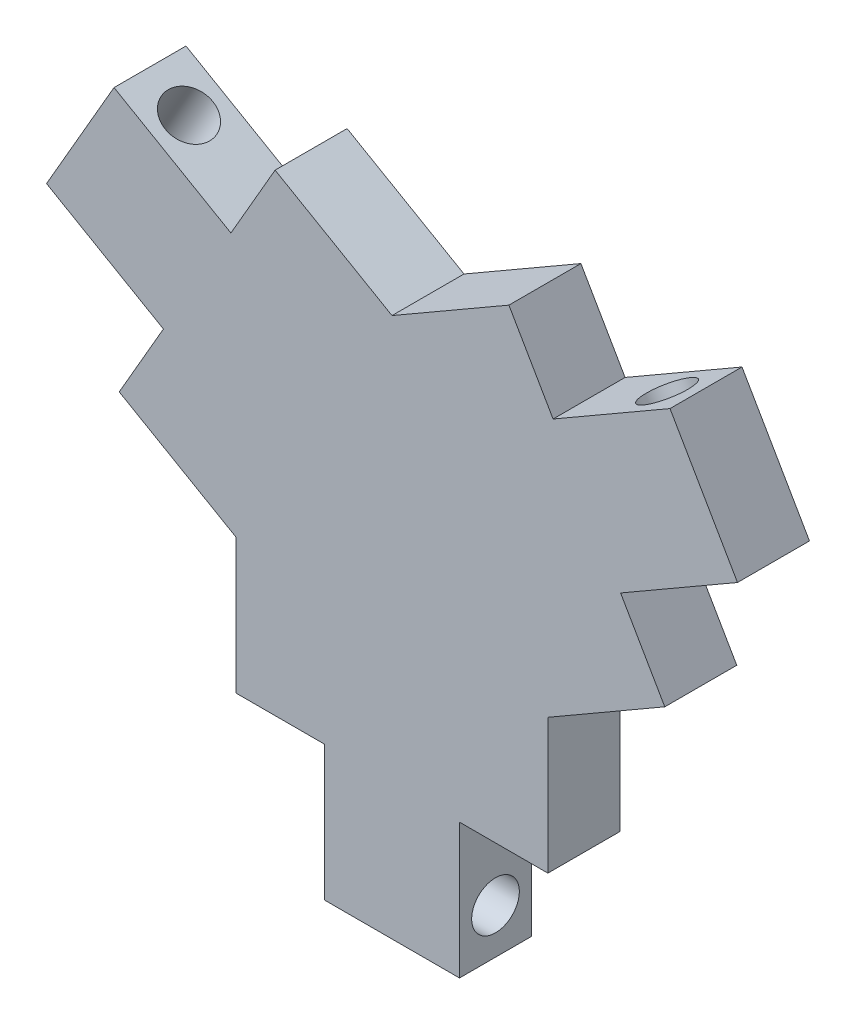
ISO-10303-21;
HEADER;
FILE_DESCRIPTION(('STEP AP214'),'2;1');
FILE_NAME('part.step','',(''),(''),'','','');
FILE_SCHEMA(('AUTOMOTIVE_DESIGN { 1 0 10303 214 1 1 1 1 }'));
ENDSEC;
DATA;
#1=APPLICATION_CONTEXT('core data for automotive mechanical design processes');
#2=APPLICATION_PROTOCOL_DEFINITION('international standard','automotive_design',2000,#1);
#3=PRODUCT_CONTEXT('',#1,'mechanical');
#4=PRODUCT('Part','Part','',(#3));
#5=PRODUCT_RELATED_PRODUCT_CATEGORY('part','',(#4));
#6=PRODUCT_DEFINITION_FORMATION('','',#4);
#7=PRODUCT_DEFINITION_CONTEXT('part definition',#1,'design');
#8=PRODUCT_DEFINITION('design','',#6,#7);
#9=PRODUCT_DEFINITION_SHAPE('','',#8);
#10=(LENGTH_UNIT() NAMED_UNIT(*) SI_UNIT(.MILLI.,.METRE.));
#11=(NAMED_UNIT(*) PLANE_ANGLE_UNIT() SI_UNIT($,.RADIAN.));
#12=(NAMED_UNIT(*) SI_UNIT($,.STERADIAN.) SOLID_ANGLE_UNIT());
#13=UNCERTAINTY_MEASURE_WITH_UNIT(LENGTH_MEASURE(1.E-05),#10,'distance_accuracy_value','');
#14=(GEOMETRIC_REPRESENTATION_CONTEXT(3) GLOBAL_UNCERTAINTY_ASSIGNED_CONTEXT((#13)) GLOBAL_UNIT_ASSIGNED_CONTEXT((#10,
#11,#12)) REPRESENTATION_CONTEXT('',''));
#15=CARTESIAN_POINT('',(0.,0.,0.));
#16=DIRECTION('',(0.,0.,1.));
#17=DIRECTION('',(1.,0.,0.));
#18=AXIS2_PLACEMENT_3D('',#15,#16,#17);
#19=CARTESIAN_POINT('',(25.9817621135331,-4.99999999999999,4.));
#20=DIRECTION('',(-1.,0.,0.));
#21=DIRECTION('',(0.,0.,1.));
#22=AXIS2_PLACEMENT_3D('',#19,#20,#21);
#23=CYLINDRICAL_SURFACE('',#22,2.65);
#24=CARTESIAN_POINT('',(-9.82050807568876,-4.99999999999999,4.));
#25=DIRECTION('',(-1.,0.,0.));
#26=DIRECTION('',(0.,0.,1.));
#27=AXIS2_PLACEMENT_3D('',#24,#25,#26);
#28=CIRCLE('',#27,2.65);
#29=CARTESIAN_POINT('',(-9.82050807568876,-4.99999999999999,6.65));
#30=VERTEX_POINT('',#29);
#31=EDGE_CURVE('E423',#30,#30,#28,.T.);
#32=ORIENTED_EDGE('',*,*,#31,.F.);
#33=EDGE_LOOP('',(#32));
#34=FACE_BOUND('',#33,.T.);
#35=CARTESIAN_POINT('',(-24.8205080756888,-4.99999999999999,4.));
#36=DIRECTION('',(1.,0.,0.));
#37=DIRECTION('',(0.,0.,-1.));
#38=AXIS2_PLACEMENT_3D('',#35,#36,#37);
#39=CIRCLE('',#38,2.65);
#40=CARTESIAN_POINT('',(-24.8205080756888,-4.99999999999999,1.35));
#41=VERTEX_POINT('',#40);
#42=EDGE_CURVE('E277',#41,#41,#39,.T.);
#43=ORIENTED_EDGE('',*,*,#42,.F.);
#44=EDGE_LOOP('',(#43));
#45=FACE_BOUND('',#44,.T.);
#46=ADVANCED_FACE('F50',(#34,#45),#23,.F.);
#47=CARTESIAN_POINT('',(-34.6410161513775,5.,-0.000999999999999265));
#48=DIRECTION('',(0.,1.,0.));
#49=DIRECTION('',(0.,0.,1.));
#50=AXIS2_PLACEMENT_3D('',#47,#48,#49);
#51=PLANE('',#50);
#52=DIRECTION('',(1.,0.,0.));
#53=VECTOR('',#52,1.);
#54=CARTESIAN_POINT('',(-34.6410161513775,5.,0.));
#55=LINE('',#54,#53);
#56=CARTESIAN_POINT('',(-34.6410161513775,5.,0.));
#57=VERTEX_POINT('',#56);
#58=CARTESIAN_POINT('',(-24.8205080756888,5.,0.));
#59=VERTEX_POINT('',#58);
#60=EDGE_CURVE('E322',#57,#59,#55,.T.);
#61=ORIENTED_EDGE('',*,*,#60,.T.);
#62=DIRECTION('',(0.,0.,1.));
#63=VECTOR('',#62,1.);
#64=CARTESIAN_POINT('',(-24.8205080756888,5.,-0.000999999999999265));
#65=LINE('',#64,#63);
#66=CARTESIAN_POINT('',(-24.8205080756888,5.,8.));
#67=VERTEX_POINT('',#66);
#68=EDGE_CURVE('E309',#59,#67,#65,.T.);
#69=ORIENTED_EDGE('',*,*,#68,.T.);
#70=DIRECTION('',(-1.,0.,0.));
#71=VECTOR('',#70,1.);
#72=CARTESIAN_POINT('',(-34.6410161513775,5.,8.));
#73=LINE('',#72,#71);
#74=CARTESIAN_POINT('',(-34.6410161513775,5.,8.));
#75=VERTEX_POINT('',#74);
#76=EDGE_CURVE('E313',#67,#75,#73,.T.);
#77=ORIENTED_EDGE('',*,*,#76,.T.);
#78=DIRECTION('',(0.,0.,1.));
#79=VECTOR('',#78,1.);
#80=CARTESIAN_POINT('',(-34.6410161513775,5.,-0.000999999999999265));
#81=LINE('',#80,#79);
#82=EDGE_CURVE('E314',#57,#75,#81,.T.);
#83=ORIENTED_EDGE('',*,*,#82,.F.);
#84=EDGE_LOOP('',(#61,#69,#77,#83));
#85=FACE_BOUND('',#84,.T.);
#86=ADVANCED_FACE('F482',(#85),#51,.F.);
#87=CARTESIAN_POINT('',(-24.8205080756888,5.,-0.000999999999999265));
#88=DIRECTION('',(1.,0.,0.));
#89=DIRECTION('',(0.,0.,-1.));
#90=AXIS2_PLACEMENT_3D('',#87,#88,#89);
#91=PLANE('',#90);
#92=DIRECTION('',(0.,-1.,0.));
#93=VECTOR('',#92,1.);
#94=CARTESIAN_POINT('',(-24.8205080756888,5.,0.));
#95=LINE('',#94,#93);
#96=CARTESIAN_POINT('',(-24.8205080756888,-9.99999999999999,0.));
#97=VERTEX_POINT('',#96);
#98=EDGE_CURVE('E300',#59,#97,#95,.T.);
#99=ORIENTED_EDGE('',*,*,#98,.T.);
#100=DIRECTION('',(0.,0.,1.));
#101=VECTOR('',#100,1.);
#102=CARTESIAN_POINT('',(-24.8205080756888,-9.99999999999999,-0.000999999999999265));
#103=LINE('',#102,#101);
#104=CARTESIAN_POINT('',(-24.8205080756888,-9.99999999999999,8.));
#105=VERTEX_POINT('',#104);
#106=EDGE_CURVE('E304',#97,#105,#103,.T.);
#107=ORIENTED_EDGE('',*,*,#106,.T.);
#108=DIRECTION('',(0.,1.,0.));
#109=VECTOR('',#108,1.);
#110=CARTESIAN_POINT('',(-24.8205080756888,5.,8.));
#111=LINE('',#110,#109);
#112=EDGE_CURVE('E316',#105,#67,#111,.T.);
#113=ORIENTED_EDGE('',*,*,#112,.T.);
#114=ORIENTED_EDGE('',*,*,#68,.F.);
#115=EDGE_LOOP('',(#99,#107,#113,#114));
#116=FACE_BOUND('',#115,.T.);
#117=ORIENTED_EDGE('',*,*,#42,.T.);
#118=EDGE_LOOP('',(#117));
#119=FACE_BOUND('',#118,.T.);
#120=ADVANCED_FACE('F481',(#116,#119),#91,.F.);
#121=CARTESIAN_POINT('',(-9.82050807568876,5.,-0.000999999999999265));
#122=DIRECTION('',(0.,1.,0.));
#123=DIRECTION('',(0.,0.,1.));
#124=AXIS2_PLACEMENT_3D('',#121,#122,#123);
#125=PLANE('',#124);
#126=DIRECTION('',(1.,0.,0.));
#127=VECTOR('',#126,1.);
#128=CARTESIAN_POINT('',(-9.82050807568876,5.,0.));
#129=LINE('',#128,#127);
#130=CARTESIAN_POINT('',(-9.82050807568876,5.,0.));
#131=VERTEX_POINT('',#130);
#132=CARTESIAN_POINT('',(0.,5.,0.));
#133=VERTEX_POINT('',#132);
#134=EDGE_CURVE('E328',#131,#133,#129,.T.);
#135=ORIENTED_EDGE('',*,*,#134,.T.);
#136=DIRECTION('',(0.,0.,1.));
#137=VECTOR('',#136,1.);
#138=CARTESIAN_POINT('',(0.,5.,-0.000999999999999265));
#139=LINE('',#138,#137);
#140=CARTESIAN_POINT('',(0.,5.,8.));
#141=VERTEX_POINT('',#140);
#142=EDGE_CURVE('E416',#133,#141,#139,.T.);
#143=ORIENTED_EDGE('',*,*,#142,.T.);
#144=DIRECTION('',(-1.,0.,0.));
#145=VECTOR('',#144,1.);
#146=CARTESIAN_POINT('',(-9.82050807568876,5.,8.));
#147=LINE('',#146,#145);
#148=CARTESIAN_POINT('',(-9.82050807568876,5.,8.));
#149=VERTEX_POINT('',#148);
#150=EDGE_CURVE('E406',#141,#149,#147,.T.);
#151=ORIENTED_EDGE('',*,*,#150,.T.);
#152=DIRECTION('',(0.,0.,1.));
#153=VECTOR('',#152,1.);
#154=CARTESIAN_POINT('',(-9.82050807568876,5.,-0.000999999999999265));
#155=LINE('',#154,#153);
#156=EDGE_CURVE('E417',#131,#149,#155,.T.);
#157=ORIENTED_EDGE('',*,*,#156,.F.);
#158=EDGE_LOOP('',(#135,#143,#151,#157));
#159=FACE_BOUND('',#158,.T.);
#160=ADVANCED_FACE('F475',(#159),#125,.F.);
#161=CARTESIAN_POINT('',(-9.82050807568876,5.,-0.000999999999999265));
#162=DIRECTION('',(-1.,0.,0.));
#163=DIRECTION('',(0.,0.,1.));
#164=AXIS2_PLACEMENT_3D('',#161,#162,#163);
#165=PLANE('',#164);
#166=DIRECTION('',(0.,1.,0.));
#167=VECTOR('',#166,1.);
#168=CARTESIAN_POINT('',(-9.82050807568876,5.,0.));
#169=LINE('',#168,#167);
#170=CARTESIAN_POINT('',(-9.82050807568876,-9.99999999999999,0.));
#171=VERTEX_POINT('',#170);
#172=EDGE_CURVE('E63',#171,#131,#169,.T.);
#173=ORIENTED_EDGE('',*,*,#172,.T.);
#174=ORIENTED_EDGE('',*,*,#156,.T.);
#175=DIRECTION('',(0.,-1.,0.));
#176=VECTOR('',#175,1.);
#177=CARTESIAN_POINT('',(-9.82050807568876,5.,8.));
#178=LINE('',#177,#176);
#179=CARTESIAN_POINT('',(-9.82050807568876,-9.99999999999999,8.));
#180=VERTEX_POINT('',#179);
#181=EDGE_CURVE('E412',#149,#180,#178,.T.);
#182=ORIENTED_EDGE('',*,*,#181,.T.);
#183=DIRECTION('',(0.,0.,1.));
#184=VECTOR('',#183,1.);
#185=CARTESIAN_POINT('',(-9.82050807568876,-9.99999999999999,-0.000999999999999265));
#186=LINE('',#185,#184);
#187=EDGE_CURVE('E303',#171,#180,#186,.T.);
#188=ORIENTED_EDGE('',*,*,#187,.F.);
#189=EDGE_LOOP('',(#173,#174,#182,#188));
#190=FACE_BOUND('',#189,.T.);
#191=ORIENTED_EDGE('',*,*,#31,.T.);
#192=EDGE_LOOP('',(#191));
#193=FACE_BOUND('',#192,.T.);
#194=ADVANCED_FACE('F478',(#190,#193),#165,.F.);
#195=CARTESIAN_POINT('',(17.3205080756888,30.,8.));
#196=DIRECTION('',(0.5,0.866025403784439,0.));
#197=DIRECTION('',(-0.866025403784439,0.5,0.));
#198=AXIS2_PLACEMENT_3D('',#195,#196,#197);
#199=PLANE('',#198);
#200=DIRECTION('',(0.866025403784439,-0.5,0.));
#201=VECTOR('',#200,1.);
#202=CARTESIAN_POINT('',(17.3205080756888,30.,0.));
#203=LINE('',#202,#201);
#204=CARTESIAN_POINT('',(-30.3108891324553,57.5,0.));
#205=VERTEX_POINT('',#204);
#206=CARTESIAN_POINT('',(-17.3205080756888,50.,0.));
#207=VERTEX_POINT('',#206);
#208=EDGE_CURVE('E276',#205,#207,#203,.T.);
#209=ORIENTED_EDGE('',*,*,#208,.F.);
#210=DIRECTION('',(0.,0.,1.));
#211=VECTOR('',#210,1.);
#212=CARTESIAN_POINT('',(-30.3108891324553,57.5,-0.000999999999999265));
#213=LINE('',#212,#211);
#214=CARTESIAN_POINT('',(-30.3108891324553,57.5,8.));
#215=VERTEX_POINT('',#214);
#216=EDGE_CURVE('E369',#205,#215,#213,.T.);
#217=ORIENTED_EDGE('',*,*,#216,.T.);
#218=DIRECTION('',(0.866025403784439,-0.5,0.));
#219=VECTOR('',#218,1.);
#220=CARTESIAN_POINT('',(17.3205080756888,30.,8.));
#221=LINE('',#220,#219);
#222=CARTESIAN_POINT('',(-17.3205080756888,50.,8.));
#223=VERTEX_POINT('',#222);
#224=EDGE_CURVE('E232',#215,#223,#221,.T.);
#225=ORIENTED_EDGE('',*,*,#224,.T.);
#226=DIRECTION('',(0.,0.,-1.));
#227=VECTOR('',#226,1.);
#228=CARTESIAN_POINT('',(-17.3205080756888,50.,8.));
#229=LINE('',#228,#227);
#230=EDGE_CURVE('E234',#223,#207,#229,.T.);
#231=ORIENTED_EDGE('',*,*,#230,.T.);
#232=EDGE_LOOP('',(#209,#217,#225,#231));
#233=FACE_BOUND('',#232,.T.);
#234=ADVANCED_FACE('F47',(#233),#199,.T.);
#235=CARTESIAN_POINT('',(-60.6217782649107,35.,8.));
#236=DIRECTION('',(-0.866025403784439,0.5,0.));
#237=DIRECTION('',(-0.5,-0.866025403784439,0.));
#238=AXIS2_PLACEMENT_3D('',#235,#236,#237);
#239=PLANE('',#238);
#240=DIRECTION('',(0.5,0.866025403784439,0.));
#241=VECTOR('',#240,1.);
#242=CARTESIAN_POINT('',(-60.6217782649107,35.,0.));
#243=LINE('',#242,#241);
#244=CARTESIAN_POINT('',(-55.7115242270663,43.5048094716167,0.));
#245=VERTEX_POINT('',#244);
#246=CARTESIAN_POINT('',(-48.2115242270663,56.4951905283833,0.));
#247=VERTEX_POINT('',#246);
#248=EDGE_CURVE('E285',#245,#247,#243,.T.);
#249=ORIENTED_EDGE('',*,*,#248,.F.);
#250=DIRECTION('',(0.,0.,1.));
#251=VECTOR('',#250,1.);
#252=CARTESIAN_POINT('',(-55.7115242270663,43.5048094716167,-0.000999999999999265));
#253=LINE('',#252,#251);
#254=CARTESIAN_POINT('',(-55.7115242270663,43.5048094716167,8.));
#255=VERTEX_POINT('',#254);
#256=EDGE_CURVE('E393',#245,#255,#253,.T.);
#257=ORIENTED_EDGE('',*,*,#256,.T.);
#258=DIRECTION('',(0.5,0.866025403784439,0.));
#259=VECTOR('',#258,1.);
#260=CARTESIAN_POINT('',(-60.6217782649107,35.,8.));
#261=LINE('',#260,#259);
#262=CARTESIAN_POINT('',(-48.2115242270663,56.4951905283833,8.));
#263=VERTEX_POINT('',#262);
#264=EDGE_CURVE('E264',#255,#263,#261,.T.);
#265=ORIENTED_EDGE('',*,*,#264,.T.);
#266=DIRECTION('',(0.,0.,1.));
#267=VECTOR('',#266,1.);
#268=CARTESIAN_POINT('',(-48.2115242270663,56.4951905283833,-0.000999999999999265));
#269=LINE('',#268,#267);
#270=EDGE_CURVE('E366',#247,#263,#269,.T.);
#271=ORIENTED_EDGE('',*,*,#270,.F.);
#272=EDGE_LOOP('',(#249,#257,#265,#271));
#273=FACE_BOUND('',#272,.T.);
#274=ADVANCED_FACE('F504',(#273),#239,.T.);
#275=CARTESIAN_POINT('',(-34.6410161513775,0.,8.));
#276=DIRECTION('',(-1.,0.,0.));
#277=DIRECTION('',(0.,0.,1.));
#278=AXIS2_PLACEMENT_3D('',#275,#276,#277);
#279=PLANE('',#278);
#280=DIRECTION('',(0.,1.,0.));
#281=VECTOR('',#280,1.);
#282=CARTESIAN_POINT('',(-34.6410161513775,0.,0.));
#283=LINE('',#282,#281);
#284=CARTESIAN_POINT('',(-34.6410161513776,20.,0.));
#285=VERTEX_POINT('',#284);
#286=EDGE_CURVE('E289',#57,#285,#283,.T.);
#287=ORIENTED_EDGE('',*,*,#286,.F.);
#288=ORIENTED_EDGE('',*,*,#82,.T.);
#289=DIRECTION('',(0.,1.,0.));
#290=VECTOR('',#289,1.);
#291=CARTESIAN_POINT('',(-34.6410161513775,0.,8.));
#292=LINE('',#291,#290);
#293=CARTESIAN_POINT('',(-34.6410161513776,20.,8.));
#294=VERTEX_POINT('',#293);
#295=EDGE_CURVE('E256',#75,#294,#292,.T.);
#296=ORIENTED_EDGE('',*,*,#295,.T.);
#297=DIRECTION('',(0.,0.,-1.));
#298=VECTOR('',#297,1.);
#299=CARTESIAN_POINT('',(-34.6410161513776,20.,8.));
#300=LINE('',#299,#298);
#301=EDGE_CURVE('E11',#294,#285,#300,.T.);
#302=ORIENTED_EDGE('',*,*,#301,.T.);
#303=EDGE_LOOP('',(#287,#288,#296,#302));
#304=FACE_BOUND('',#303,.T.);
#305=ADVANCED_FACE('F490',(#304),#279,.T.);
#306=CARTESIAN_POINT('',(0.,-9.99999999999999,8.));
#307=DIRECTION('',(0.,-1.,0.));
#308=DIRECTION('',(0.,0.,-1.));
#309=AXIS2_PLACEMENT_3D('',#306,#307,#308);
#310=PLANE('',#309);
#311=DIRECTION('',(-1.,0.,0.));
#312=VECTOR('',#311,1.);
#313=CARTESIAN_POINT('',(0.,-9.99999999999999,0.));
#314=LINE('',#313,#312);
#315=EDGE_CURVE('E230',#171,#97,#314,.T.);
#316=ORIENTED_EDGE('',*,*,#315,.F.);
#317=ORIENTED_EDGE('',*,*,#187,.T.);
#318=DIRECTION('',(-1.,0.,0.));
#319=VECTOR('',#318,1.);
#320=CARTESIAN_POINT('',(0.,-9.99999999999999,8.));
#321=LINE('',#320,#319);
#322=EDGE_CURVE('E255',#180,#105,#321,.T.);
#323=ORIENTED_EDGE('',*,*,#322,.T.);
#324=ORIENTED_EDGE('',*,*,#106,.F.);
#325=EDGE_LOOP('',(#316,#317,#323,#324));
#326=FACE_BOUND('',#325,.T.);
#327=ADVANCED_FACE('F305',(#326),#310,.T.);
#328=CARTESIAN_POINT('',(-8.66025403784439,15.,8.));
#329=DIRECTION('',(0.5,-0.866025403784439,0.));
#330=DIRECTION('',(0.866025403784439,0.5,0.));
#331=AXIS2_PLACEMENT_3D('',#328,#329,#330);
#332=PLANE('',#331);
#333=DIRECTION('',(-0.866025403784439,-0.5,0.));
#334=VECTOR('',#333,1.);
#335=CARTESIAN_POINT('',(-8.66025403784439,15.,0.));
#336=LINE('',#335,#334);
#337=CARTESIAN_POINT('',(12.9903810567666,27.5,0.));
#338=VERTEX_POINT('',#337);
#339=CARTESIAN_POINT('',(0.,20.,0.));
#340=VERTEX_POINT('',#339);
#341=EDGE_CURVE('E208',#338,#340,#336,.T.);
#342=ORIENTED_EDGE('',*,*,#341,.F.);
#343=DIRECTION('',(0.,0.,1.));
#344=VECTOR('',#343,1.);
#345=CARTESIAN_POINT('',(12.9903810567666,27.5,-0.000999999999999265));
#346=LINE('',#345,#344);
#347=CARTESIAN_POINT('',(12.9903810567666,27.5,8.));
#348=VERTEX_POINT('',#347);
#349=EDGE_CURVE('E186',#338,#348,#346,.T.);
#350=ORIENTED_EDGE('',*,*,#349,.T.);
#351=DIRECTION('',(-0.866025403784439,-0.5,0.));
#352=VECTOR('',#351,1.);
#353=CARTESIAN_POINT('',(-8.66025403784439,15.,8.));
#354=LINE('',#353,#352);
#355=CARTESIAN_POINT('',(0.,20.,8.));
#356=VERTEX_POINT('',#355);
#357=EDGE_CURVE('E250',#348,#356,#354,.T.);
#358=ORIENTED_EDGE('',*,*,#357,.T.);
#359=DIRECTION('',(0.,0.,-1.));
#360=VECTOR('',#359,1.);
#361=CARTESIAN_POINT('',(0.,20.,8.));
#362=LINE('',#361,#360);
#363=EDGE_CURVE('E57',#356,#340,#362,.T.);
#364=ORIENTED_EDGE('',*,*,#363,.T.);
#365=EDGE_LOOP('',(#342,#350,#358,#364));
#366=FACE_BOUND('',#365,.T.);
#367=ADVANCED_FACE('F216',(#366),#332,.T.);
#368=CARTESIAN_POINT('',(34.6410161513775,20.,8.));
#369=DIRECTION('',(0.866025403784439,0.5,0.));
#370=DIRECTION('',(-0.5,0.866025403784439,0.));
#371=AXIS2_PLACEMENT_3D('',#368,#369,#370);
#372=PLANE('',#371);
#373=DIRECTION('',(0.5,-0.866025403784439,0.));
#374=VECTOR('',#373,1.);
#375=CARTESIAN_POINT('',(34.6410161513775,20.,0.));
#376=LINE('',#375,#374);
#377=CARTESIAN_POINT('',(13.5705080756888,56.4951905283833,0.));
#378=VERTEX_POINT('',#377);
#379=CARTESIAN_POINT('',(21.0705080756888,43.5048094716167,0.));
#380=VERTEX_POINT('',#379);
#381=EDGE_CURVE('E219',#378,#380,#376,.T.);
#382=ORIENTED_EDGE('',*,*,#381,.F.);
#383=DIRECTION('',(0.,0.,1.));
#384=VECTOR('',#383,1.);
#385=CARTESIAN_POINT('',(13.5705080756888,56.4951905283833,-0.000999999999999265));
#386=LINE('',#385,#384);
#387=CARTESIAN_POINT('',(13.5705080756888,56.4951905283833,8.));
#388=VERTEX_POINT('',#387);
#389=EDGE_CURVE('E345',#378,#388,#386,.T.);
#390=ORIENTED_EDGE('',*,*,#389,.T.);
#391=DIRECTION('',(0.5,-0.866025403784439,0.));
#392=VECTOR('',#391,1.);
#393=CARTESIAN_POINT('',(34.6410161513775,20.,8.));
#394=LINE('',#393,#392);
#395=CARTESIAN_POINT('',(21.0705080756888,43.5048094716168,8.));
#396=VERTEX_POINT('',#395);
#397=EDGE_CURVE('E243',#388,#396,#394,.T.);
#398=ORIENTED_EDGE('',*,*,#397,.T.);
#399=DIRECTION('',(0.,0.,1.));
#400=VECTOR('',#399,1.);
#401=CARTESIAN_POINT('',(21.0705080756888,43.5048094716168,-0.000999999999999265));
#402=LINE('',#401,#400);
#403=EDGE_CURVE('E434',#380,#396,#402,.T.);
#404=ORIENTED_EDGE('',*,*,#403,.F.);
#405=EDGE_LOOP('',(#382,#390,#398,#404));
#406=FACE_BOUND('',#405,.T.);
#407=ADVANCED_FACE('F455',(#406),#372,.T.);
#408=CARTESIAN_POINT('',(0.,0.,0.));
#409=DIRECTION('',(0.,0.,1.));
#410=DIRECTION('',(1.,0.,0.));
#411=AXIS2_PLACEMENT_3D('',#408,#409,#410);
#412=PLANE('',#411);
#413=ORIENTED_EDGE('',*,*,#172,.F.);
#414=ORIENTED_EDGE('',*,*,#315,.T.);
#415=ORIENTED_EDGE('',*,*,#98,.F.);
#416=ORIENTED_EDGE('',*,*,#60,.F.);
#417=ORIENTED_EDGE('',*,*,#286,.T.);
#418=DIRECTION('',(-0.866025403784437,0.500000000000002,0.));
#419=VECTOR('',#418,1.);
#420=CARTESIAN_POINT('',(0.,-1.3220368468887E-13,0.));
#421=LINE('',#420,#419);
#422=CARTESIAN_POINT('',(-47.6313972081441,27.5,0.));
#423=VERTEX_POINT('',#422);
#424=EDGE_CURVE('E286',#285,#423,#421,.T.);
#425=ORIENTED_EDGE('',*,*,#424,.T.);
#426=DIRECTION('',(-0.499999999999999,-0.86602540378444,0.));
#427=VECTOR('',#426,1.);
#428=CARTESIAN_POINT('',(-42.7211431702997,36.0048094716167,0.));
#429=LINE('',#428,#427);
#430=CARTESIAN_POINT('',(-42.7211431702997,36.0048094716167,0.));
#431=VERTEX_POINT('',#430);
#432=EDGE_CURVE('E398',#431,#423,#429,.T.);
#433=ORIENTED_EDGE('',*,*,#432,.F.);
#434=DIRECTION('',(0.866025403784439,-0.499999999999999,0.));
#435=VECTOR('',#434,1.);
#436=CARTESIAN_POINT('',(-55.7115242270663,43.5048094716167,0.));
#437=LINE('',#436,#435);
#438=EDGE_CURVE('E72',#245,#431,#437,.T.);
#439=ORIENTED_EDGE('',*,*,#438,.F.);
#440=ORIENTED_EDGE('',*,*,#248,.T.);
#441=DIRECTION('',(-0.866025403784439,0.499999999999999,0.));
#442=VECTOR('',#441,1.);
#443=CARTESIAN_POINT('',(-48.2115242270663,56.4951905283833,0.));
#444=LINE('',#443,#442);
#445=CARTESIAN_POINT('',(-35.2211431702997,48.9951905283833,0.));
#446=VERTEX_POINT('',#445);
#447=EDGE_CURVE('E334',#446,#247,#444,.T.);
#448=ORIENTED_EDGE('',*,*,#447,.F.);
#449=DIRECTION('',(-0.499999999999999,-0.866025403784439,0.));
#450=VECTOR('',#449,1.);
#451=CARTESIAN_POINT('',(-30.3108891324553,57.5,0.));
#452=LINE('',#451,#450);
#453=EDGE_CURVE('E360',#205,#446,#452,.T.);
#454=ORIENTED_EDGE('',*,*,#453,.F.);
#455=ORIENTED_EDGE('',*,*,#208,.T.);
#456=DIRECTION('',(0.866025403784439,0.5,0.));
#457=VECTOR('',#456,1.);
#458=CARTESIAN_POINT('',(-25.9807621135332,45.,0.));
#459=LINE('',#458,#457);
#460=CARTESIAN_POINT('',(-4.33012701892219,57.5,0.));
#461=VERTEX_POINT('',#460);
#462=EDGE_CURVE('E223',#207,#461,#459,.T.);
#463=ORIENTED_EDGE('',*,*,#462,.T.);
#464=DIRECTION('',(-0.500000000000001,0.866025403784438,0.));
#465=VECTOR('',#464,1.);
#466=CARTESIAN_POINT('',(0.580127018922199,48.9951905283833,0.));
#467=LINE('',#466,#465);
#468=CARTESIAN_POINT('',(0.580127018922199,48.9951905283833,0.));
#469=VERTEX_POINT('',#468);
#470=EDGE_CURVE('E350',#469,#461,#467,.T.);
#471=ORIENTED_EDGE('',*,*,#470,.F.);
#472=DIRECTION('',(-0.866025403784438,-0.500000000000001,0.));
#473=VECTOR('',#472,1.);
#474=CARTESIAN_POINT('',(13.5705080756888,56.4951905283833,0.));
#475=LINE('',#474,#473);
#476=EDGE_CURVE('E329',#378,#469,#475,.T.);
#477=ORIENTED_EDGE('',*,*,#476,.F.);
#478=ORIENTED_EDGE('',*,*,#381,.T.);
#479=DIRECTION('',(0.866025403784438,0.500000000000002,0.));
#480=VECTOR('',#479,1.);
#481=CARTESIAN_POINT('',(21.0705080756888,43.5048094716168,0.));
#482=LINE('',#481,#480);
#483=CARTESIAN_POINT('',(8.08012701892221,36.0048094716167,0.));
#484=VERTEX_POINT('',#483);
#485=EDGE_CURVE('E211',#484,#380,#482,.T.);
#486=ORIENTED_EDGE('',*,*,#485,.F.);
#487=DIRECTION('',(-0.500000000000002,0.866025403784438,0.));
#488=VECTOR('',#487,1.);
#489=CARTESIAN_POINT('',(12.9903810567666,27.5,0.));
#490=LINE('',#489,#488);
#491=EDGE_CURVE('E193',#338,#484,#490,.T.);
#492=ORIENTED_EDGE('',*,*,#491,.F.);
#493=ORIENTED_EDGE('',*,*,#341,.T.);
#494=DIRECTION('',(0.,-1.,0.));
#495=VECTOR('',#494,1.);
#496=CARTESIAN_POINT('',(0.,0.,0.));
#497=LINE('',#496,#495);
#498=EDGE_CURVE('E222',#340,#133,#497,.T.);
#499=ORIENTED_EDGE('',*,*,#498,.T.);
#500=ORIENTED_EDGE('',*,*,#134,.F.);
#501=EDGE_LOOP('',(#413,#414,#415,#416,#417,#425,#433,#439,#440,#448,#454,#455,#463,#471,#477,
#478,#486,#492,#493,#499,#500));
#502=FACE_BOUND('',#501,.T.);
#503=ADVANCED_FACE('F206',(#502),#412,.F.);
#504=CARTESIAN_POINT('',(0.,-1.3220368468887E-13,8.));
#505=DIRECTION('',(-0.500000000000002,-0.866025403784437,0.));
#506=DIRECTION('',(0.866025403784437,-0.500000000000002,0.));
#507=AXIS2_PLACEMENT_3D('',#504,#505,#506);
#508=PLANE('',#507);
#509=DIRECTION('',(0.,0.,1.));
#510=VECTOR('',#509,1.);
#511=CARTESIAN_POINT('',(-47.6313972081441,27.5,-0.000999999999999265));
#512=LINE('',#511,#510);
#513=CARTESIAN_POINT('',(-47.6313972081441,27.5,8.));
#514=VERTEX_POINT('',#513);
#515=EDGE_CURVE('E395',#423,#514,#512,.T.);
#516=ORIENTED_EDGE('',*,*,#515,.F.);
#517=ORIENTED_EDGE('',*,*,#424,.F.);
#518=ORIENTED_EDGE('',*,*,#301,.F.);
#519=DIRECTION('',(-0.866025403784437,0.500000000000002,0.));
#520=VECTOR('',#519,1.);
#521=CARTESIAN_POINT('',(0.,-1.3220368468887E-13,8.));
#522=LINE('',#521,#520);
#523=EDGE_CURVE('E261',#294,#514,#522,.T.);
#524=ORIENTED_EDGE('',*,*,#523,.T.);
#525=EDGE_LOOP('',(#516,#517,#518,#524));
#526=FACE_BOUND('',#525,.T.);
#527=ADVANCED_FACE('F492',(#526),#508,.T.);
#528=CARTESIAN_POINT('',(0.,0.,8.));
#529=DIRECTION('',(1.,0.,0.));
#530=DIRECTION('',(0.,1.,0.));
#531=AXIS2_PLACEMENT_3D('',#528,#529,#530);
#532=PLANE('',#531);
#533=ORIENTED_EDGE('',*,*,#142,.F.);
#534=ORIENTED_EDGE('',*,*,#498,.F.);
#535=ORIENTED_EDGE('',*,*,#363,.F.);
#536=DIRECTION('',(0.,-1.,0.));
#537=VECTOR('',#536,1.);
#538=CARTESIAN_POINT('',(0.,0.,8.));
#539=LINE('',#538,#537);
#540=EDGE_CURVE('E249',#356,#141,#539,.T.);
#541=ORIENTED_EDGE('',*,*,#540,.T.);
#542=EDGE_LOOP('',(#533,#534,#535,#541));
#543=FACE_BOUND('',#542,.T.);
#544=ADVANCED_FACE('F472',(#543),#532,.T.);
#545=CARTESIAN_POINT('',(-25.9807621135332,45.,8.));
#546=DIRECTION('',(-0.5,0.866025403784439,0.));
#547=DIRECTION('',(-0.866025403784439,-0.5,0.));
#548=AXIS2_PLACEMENT_3D('',#545,#546,#547);
#549=PLANE('',#548);
#550=DIRECTION('',(0.,0.,1.));
#551=VECTOR('',#550,1.);
#552=CARTESIAN_POINT('',(-4.33012701892219,57.5,-0.000999999999999265));
#553=LINE('',#552,#551);
#554=CARTESIAN_POINT('',(-4.33012701892219,57.5,8.));
#555=VERTEX_POINT('',#554);
#556=EDGE_CURVE('E341',#461,#555,#553,.T.);
#557=ORIENTED_EDGE('',*,*,#556,.F.);
#558=ORIENTED_EDGE('',*,*,#462,.F.);
#559=ORIENTED_EDGE('',*,*,#230,.F.);
#560=DIRECTION('',(0.866025403784439,0.5,0.));
#561=VECTOR('',#560,1.);
#562=CARTESIAN_POINT('',(-25.9807621135332,45.,8.));
#563=LINE('',#562,#561);
#564=EDGE_CURVE('E236',#223,#555,#563,.T.);
#565=ORIENTED_EDGE('',*,*,#564,.T.);
#566=EDGE_LOOP('',(#557,#558,#559,#565));
#567=FACE_BOUND('',#566,.T.);
#568=ADVANCED_FACE('F518',(#567),#549,.T.);
#569=CARTESIAN_POINT('',(0.,0.,8.));
#570=DIRECTION('',(0.,0.,1.));
#571=DIRECTION('',(1.,0.,0.));
#572=AXIS2_PLACEMENT_3D('',#569,#570,#571);
#573=PLANE('',#572);
#574=ORIENTED_EDGE('',*,*,#150,.F.);
#575=ORIENTED_EDGE('',*,*,#540,.F.);
#576=ORIENTED_EDGE('',*,*,#357,.F.);
#577=DIRECTION('',(0.500000000000002,-0.866025403784437,0.));
#578=VECTOR('',#577,1.);
#579=CARTESIAN_POINT('',(12.9903810567666,27.5,8.));
#580=LINE('',#579,#578);
#581=CARTESIAN_POINT('',(8.08012701892221,36.0048094716167,8.));
#582=VERTEX_POINT('',#581);
#583=EDGE_CURVE('E198',#582,#348,#580,.T.);
#584=ORIENTED_EDGE('',*,*,#583,.F.);
#585=DIRECTION('',(-0.866025403784438,-0.500000000000002,0.));
#586=VECTOR('',#585,1.);
#587=CARTESIAN_POINT('',(21.0705080756888,43.5048094716168,8.));
#588=LINE('',#587,#586);
#589=EDGE_CURVE('E212',#396,#582,#588,.T.);
#590=ORIENTED_EDGE('',*,*,#589,.F.);
#591=ORIENTED_EDGE('',*,*,#397,.F.);
#592=DIRECTION('',(0.866025403784438,0.5,0.));
#593=VECTOR('',#592,1.);
#594=CARTESIAN_POINT('',(13.5705080756888,56.4951905283833,8.));
#595=LINE('',#594,#593);
#596=CARTESIAN_POINT('',(0.580127018922199,48.9951905283833,8.));
#597=VERTEX_POINT('',#596);
#598=EDGE_CURVE('E338',#597,#388,#595,.T.);
#599=ORIENTED_EDGE('',*,*,#598,.F.);
#600=DIRECTION('',(0.500000000000001,-0.866025403784438,0.));
#601=VECTOR('',#600,1.);
#602=CARTESIAN_POINT('',(0.580127018922199,48.9951905283833,8.));
#603=LINE('',#602,#601);
#604=EDGE_CURVE('E331',#555,#597,#603,.T.);
#605=ORIENTED_EDGE('',*,*,#604,.F.);
#606=ORIENTED_EDGE('',*,*,#564,.F.);
#607=ORIENTED_EDGE('',*,*,#224,.F.);
#608=DIRECTION('',(0.499999999999999,0.866025403784439,0.));
#609=VECTOR('',#608,1.);
#610=CARTESIAN_POINT('',(-30.3108891324553,57.5,8.));
#611=LINE('',#610,#609);
#612=CARTESIAN_POINT('',(-35.2211431702997,48.9951905283833,8.));
#613=VERTEX_POINT('',#612);
#614=EDGE_CURVE('E364',#613,#215,#611,.T.);
#615=ORIENTED_EDGE('',*,*,#614,.F.);
#616=DIRECTION('',(0.866025403784439,-0.499999999999999,0.));
#617=VECTOR('',#616,1.);
#618=CARTESIAN_POINT('',(-48.2115242270663,56.4951905283833,8.));
#619=LINE('',#618,#617);
#620=EDGE_CURVE('E363',#263,#613,#619,.T.);
#621=ORIENTED_EDGE('',*,*,#620,.F.);
#622=ORIENTED_EDGE('',*,*,#264,.F.);
#623=DIRECTION('',(-0.866025403784439,0.499999999999999,0.));
#624=VECTOR('',#623,1.);
#625=CARTESIAN_POINT('',(-55.7115242270663,43.5048094716167,8.));
#626=LINE('',#625,#624);
#627=CARTESIAN_POINT('',(-42.7211431702997,36.0048094716167,8.));
#628=VERTEX_POINT('',#627);
#629=EDGE_CURVE('E386',#628,#255,#626,.T.);
#630=ORIENTED_EDGE('',*,*,#629,.F.);
#631=DIRECTION('',(0.499999999999999,0.866025403784439,0.));
#632=VECTOR('',#631,1.);
#633=CARTESIAN_POINT('',(-42.7211431702997,36.0048094716167,8.));
#634=LINE('',#633,#632);
#635=EDGE_CURVE('E384',#514,#628,#634,.T.);
#636=ORIENTED_EDGE('',*,*,#635,.F.);
#637=ORIENTED_EDGE('',*,*,#523,.F.);
#638=ORIENTED_EDGE('',*,*,#295,.F.);
#639=ORIENTED_EDGE('',*,*,#76,.F.);
#640=ORIENTED_EDGE('',*,*,#112,.F.);
#641=ORIENTED_EDGE('',*,*,#322,.F.);
#642=ORIENTED_EDGE('',*,*,#181,.F.);
#643=EDGE_LOOP('',(#574,#575,#576,#584,#590,#591,#599,#605,#606,#607,#615,#621,#622,#630,#636,
#637,#638,#639,#640,#641,#642));
#644=FACE_BOUND('',#643,.T.);
#645=ADVANCED_FACE('F468',(#644),#573,.T.);
#646=CARTESIAN_POINT('',(12.9903810567666,27.5,-0.000999999999999265));
#647=DIRECTION('',(-0.866025403784437,-0.500000000000002,0.));
#648=DIRECTION('',(0.500000000000002,-0.866025403784438,0.));
#649=AXIS2_PLACEMENT_3D('',#646,#647,#648);
#650=PLANE('',#649);
#651=ORIENTED_EDGE('',*,*,#491,.T.);
#652=DIRECTION('',(0.,0.,1.));
#653=VECTOR('',#652,1.);
#654=CARTESIAN_POINT('',(8.08012701892221,36.0048094716167,-0.000999999999999265));
#655=LINE('',#654,#653);
#656=EDGE_CURVE('E203',#484,#582,#655,.T.);
#657=ORIENTED_EDGE('',*,*,#656,.T.);
#658=ORIENTED_EDGE('',*,*,#583,.T.);
#659=ORIENTED_EDGE('',*,*,#349,.F.);
#660=EDGE_LOOP('',(#651,#657,#658,#659));
#661=FACE_BOUND('',#660,.T.);
#662=ADVANCED_FACE('F195',(#661),#650,.F.);
#663=CARTESIAN_POINT('',(21.0705080756888,43.5048094716168,-0.000999999999999265));
#664=DIRECTION('',(-0.500000000000002,0.866025403784437,0.));
#665=DIRECTION('',(-0.866025403784438,-0.500000000000002,0.));
#666=AXIS2_PLACEMENT_3D('',#663,#664,#665);
#667=PLANE('',#666);
#668=ORIENTED_EDGE('',*,*,#485,.T.);
#669=ORIENTED_EDGE('',*,*,#403,.T.);
#670=ORIENTED_EDGE('',*,*,#589,.T.);
#671=ORIENTED_EDGE('',*,*,#656,.F.);
#672=EDGE_LOOP('',(#668,#669,#670,#671));
#673=FACE_BOUND('',#672,.T.);
#674=CARTESIAN_POINT('',(16.7403810567666,41.0048094716167,4.));
#675=DIRECTION('',(-0.500000000000002,0.866025403784437,0.));
#676=DIRECTION('',(-0.866025403784438,-0.500000000000002,0.));
#677=AXIS2_PLACEMENT_3D('',#674,#675,#676);
#678=CIRCLE('',#677,2.65);
#679=CARTESIAN_POINT('',(19.0353483767954,42.3298094716167,4.));
#680=VERTEX_POINT('',#679);
#681=EDGE_CURVE('E205',#680,#680,#678,.T.);
#682=ORIENTED_EDGE('',*,*,#681,.T.);
#683=EDGE_LOOP('',(#682));
#684=FACE_BOUND('',#683,.T.);
#685=ADVANCED_FACE('F450',(#673,#684),#667,.F.);
#686=CARTESIAN_POINT('',(0.580127018922199,48.9951905283833,-0.000999999999999265));
#687=DIRECTION('',(-0.866025403784438,-0.500000000000001,0.));
#688=DIRECTION('',(0.500000000000001,-0.866025403784438,0.));
#689=AXIS2_PLACEMENT_3D('',#686,#687,#688);
#690=PLANE('',#689);
#691=ORIENTED_EDGE('',*,*,#470,.T.);
#692=ORIENTED_EDGE('',*,*,#556,.T.);
#693=ORIENTED_EDGE('',*,*,#604,.T.);
#694=DIRECTION('',(0.,0.,1.));
#695=VECTOR('',#694,1.);
#696=CARTESIAN_POINT('',(0.580127018922199,48.9951905283833,-0.000999999999999265));
#697=LINE('',#696,#695);
#698=EDGE_CURVE('E347',#469,#597,#697,.T.);
#699=ORIENTED_EDGE('',*,*,#698,.F.);
#700=EDGE_LOOP('',(#691,#692,#693,#699));
#701=FACE_BOUND('',#700,.T.);
#702=ADVANCED_FACE('F462',(#701),#690,.F.);
#703=CARTESIAN_POINT('',(13.5705080756888,56.4951905283833,-0.000999999999999265));
#704=DIRECTION('',(0.5,-0.866025403784438,0.));
#705=DIRECTION('',(0.866025403784438,0.500000000000001,0.));
#706=AXIS2_PLACEMENT_3D('',#703,#704,#705);
#707=PLANE('',#706);
#708=ORIENTED_EDGE('',*,*,#476,.T.);
#709=ORIENTED_EDGE('',*,*,#698,.T.);
#710=ORIENTED_EDGE('',*,*,#598,.T.);
#711=ORIENTED_EDGE('',*,*,#389,.F.);
#712=EDGE_LOOP('',(#708,#709,#710,#711));
#713=FACE_BOUND('',#712,.T.);
#714=CARTESIAN_POINT('',(9.24038105676659,53.9951905283833,4.));
#715=DIRECTION('',(0.5,-0.866025403784438,0.));
#716=DIRECTION('',(0.866025403784438,0.500000000000001,0.));
#717=AXIS2_PLACEMENT_3D('',#714,#715,#716);
#718=CIRCLE('',#717,2.65);
#719=CARTESIAN_POINT('',(11.5353483767954,55.3201905283833,4.));
#720=VERTEX_POINT('',#719);
#721=EDGE_CURVE('E213',#720,#720,#718,.T.);
#722=ORIENTED_EDGE('',*,*,#721,.T.);
#723=EDGE_LOOP('',(#722));
#724=FACE_BOUND('',#723,.T.);
#725=ADVANCED_FACE('F456',(#713,#724),#707,.F.);
#726=CARTESIAN_POINT('',(-30.3108891324553,57.5,-0.000999999999999265));
#727=DIRECTION('',(0.866025403784439,-0.499999999999999,0.));
#728=DIRECTION('',(0.499999999999999,0.866025403784439,0.));
#729=AXIS2_PLACEMENT_3D('',#726,#727,#728);
#730=PLANE('',#729);
#731=ORIENTED_EDGE('',*,*,#453,.T.);
#732=DIRECTION('',(0.,0.,1.));
#733=VECTOR('',#732,1.);
#734=CARTESIAN_POINT('',(-35.2211431702997,48.9951905283833,-0.000999999999999265));
#735=LINE('',#734,#733);
#736=EDGE_CURVE('E375',#446,#613,#735,.T.);
#737=ORIENTED_EDGE('',*,*,#736,.T.);
#738=ORIENTED_EDGE('',*,*,#614,.T.);
#739=ORIENTED_EDGE('',*,*,#216,.F.);
#740=EDGE_LOOP('',(#731,#737,#738,#739));
#741=FACE_BOUND('',#740,.T.);
#742=ADVANCED_FACE('F576',(#741),#730,.F.);
#743=CARTESIAN_POINT('',(-48.2115242270663,56.4951905283833,-0.000999999999999265));
#744=DIRECTION('',(-0.499999999999999,-0.866025403784439,0.));
#745=DIRECTION('',(0.866025403784439,-0.499999999999999,0.));
#746=AXIS2_PLACEMENT_3D('',#743,#744,#745);
#747=PLANE('',#746);
#748=ORIENTED_EDGE('',*,*,#447,.T.);
#749=ORIENTED_EDGE('',*,*,#270,.T.);
#750=ORIENTED_EDGE('',*,*,#620,.T.);
#751=ORIENTED_EDGE('',*,*,#736,.F.);
#752=EDGE_LOOP('',(#748,#749,#750,#751));
#753=FACE_BOUND('',#752,.T.);
#754=CARTESIAN_POINT('',(-43.8813972081441,53.9951905283833,4.));
#755=DIRECTION('',(-0.499999999999999,-0.866025403784439,0.));
#756=DIRECTION('',(0.866025403784439,-0.499999999999999,0.));
#757=AXIS2_PLACEMENT_3D('',#754,#755,#756);
#758=CIRCLE('',#757,2.65000000000001);
#759=CARTESIAN_POINT('',(-41.5864298881153,52.6701905283833,4.));
#760=VERTEX_POINT('',#759);
#761=EDGE_CURVE('E373',#760,#760,#758,.T.);
#762=ORIENTED_EDGE('',*,*,#761,.T.);
#763=EDGE_LOOP('',(#762));
#764=FACE_BOUND('',#763,.T.);
#765=ADVANCED_FACE('F509',(#753,#764),#747,.F.);
#766=CARTESIAN_POINT('',(-42.7211431702997,36.0048094716167,-0.000999999999999265));
#767=DIRECTION('',(0.866025403784439,-0.499999999999999,0.));
#768=DIRECTION('',(0.499999999999999,0.86602540378444,0.));
#769=AXIS2_PLACEMENT_3D('',#766,#767,#768);
#770=PLANE('',#769);
#771=ORIENTED_EDGE('',*,*,#432,.T.);
#772=ORIENTED_EDGE('',*,*,#515,.T.);
#773=ORIENTED_EDGE('',*,*,#635,.T.);
#774=DIRECTION('',(0.,0.,1.));
#775=VECTOR('',#774,1.);
#776=CARTESIAN_POINT('',(-42.7211431702997,36.0048094716167,-0.000999999999999265));
#777=LINE('',#776,#775);
#778=EDGE_CURVE('E400',#431,#628,#777,.T.);
#779=ORIENTED_EDGE('',*,*,#778,.F.);
#780=EDGE_LOOP('',(#771,#772,#773,#779));
#781=FACE_BOUND('',#780,.T.);
#782=ADVANCED_FACE('F500',(#781),#770,.F.);
#783=CARTESIAN_POINT('',(-55.7115242270663,43.5048094716167,-0.000999999999999265));
#784=DIRECTION('',(0.499999999999999,0.866025403784439,0.));
#785=DIRECTION('',(-0.866025403784439,0.499999999999999,0.));
#786=AXIS2_PLACEMENT_3D('',#783,#784,#785);
#787=PLANE('',#786);
#788=ORIENTED_EDGE('',*,*,#438,.T.);
#789=ORIENTED_EDGE('',*,*,#778,.T.);
#790=ORIENTED_EDGE('',*,*,#629,.T.);
#791=ORIENTED_EDGE('',*,*,#256,.F.);
#792=EDGE_LOOP('',(#788,#789,#790,#791));
#793=FACE_BOUND('',#792,.T.);
#794=CARTESIAN_POINT('',(-51.3813972081441,41.0048094716167,4.));
#795=DIRECTION('',(0.499999999999999,0.866025403784439,0.));
#796=DIRECTION('',(-0.866025403784439,0.499999999999999,0.));
#797=AXIS2_PLACEMENT_3D('',#794,#795,#796);
#798=CIRCLE('',#797,2.65000000000001);
#799=CARTESIAN_POINT('',(-53.6763645281728,42.3298094716167,4.));
#800=VERTEX_POINT('',#799);
#801=EDGE_CURVE('E359',#800,#800,#798,.T.);
#802=ORIENTED_EDGE('',*,*,#801,.T.);
#803=EDGE_LOOP('',(#802));
#804=FACE_BOUND('',#803,.T.);
#805=ADVANCED_FACE('F498',(#793,#804),#787,.F.);
#806=CARTESIAN_POINT('',(-12.9910640694685,92.5011830127019,4.));
#807=DIRECTION('',(0.5,-0.866025403784438,0.));
#808=DIRECTION('',(0.866025403784439,0.5,0.));
#809=AXIS2_PLACEMENT_3D('',#806,#807,#808);
#810=CYLINDRICAL_SURFACE('',#809,2.65);
#811=CARTESIAN_POINT('',(11.5353483767954,55.3201905283833,4.));
#812=CARTESIAN_POINT('',(11.6134733767954,55.184874059042,4.));
#813=CARTESIAN_POINT('',(11.6915983767954,55.0495575897007,4.));
#814=CARTESIAN_POINT('',(11.8478483767954,54.778924651018,4.));
#815=CARTESIAN_POINT('',(11.9259733767954,54.6436081816767,4.));
#816=CARTESIAN_POINT('',(12.0822233767954,54.3729752429941,4.));
#817=CARTESIAN_POINT('',(12.1603483767954,54.2376587736528,4.));
#818=CARTESIAN_POINT('',(12.3165983767954,53.9670258349701,4.));
#819=CARTESIAN_POINT('',(12.3947233767954,53.8317093656288,4.));
#820=CARTESIAN_POINT('',(12.5509733767954,53.5610764269462,4.));
#821=CARTESIAN_POINT('',(12.6290983767954,53.4257599576048,4.));
#822=CARTESIAN_POINT('',(12.7853483767954,53.1551270189222,4.));
#823=CARTESIAN_POINT('',(12.8634733767954,53.0198105495809,4.));
#824=CARTESIAN_POINT('',(13.0197233767954,52.7491776108983,4.));
#825=CARTESIAN_POINT('',(13.0978483767954,52.6138611415569,4.));
#826=CARTESIAN_POINT('',(13.2540983767954,52.3432282028743,4.));
#827=CARTESIAN_POINT('',(13.3322233767954,52.207911733533,4.));
#828=CARTESIAN_POINT('',(13.4884733767954,51.9372787948503,4.));
#829=CARTESIAN_POINT('',(13.5665983767954,51.801962325509,4.));
#830=CARTESIAN_POINT('',(13.7228483767954,51.5313293868264,4.));
#831=CARTESIAN_POINT('',(13.8009733767954,51.3960129174851,4.));
#832=CARTESIAN_POINT('',(13.9572233767954,51.1253799788024,4.));
#833=CARTESIAN_POINT('',(14.0353483767954,50.9900635094611,4.));
#834=CARTESIAN_POINT('',(14.1915983767954,50.7194305707785,4.));
#835=CARTESIAN_POINT('',(14.2697233767954,50.5841141014372,4.));
#836=CARTESIAN_POINT('',(14.4259733767954,50.3134811627545,4.));
#837=CARTESIAN_POINT('',(14.5040983767953,50.1781646934132,4.));
#838=CARTESIAN_POINT('',(14.6603483767953,49.9075317547306,4.));
#839=CARTESIAN_POINT('',(14.7384733767953,49.7722152853893,4.));
#840=CARTESIAN_POINT('',(14.8947233767954,49.5015823467066,4.));
#841=CARTESIAN_POINT('',(14.9728483767954,49.3662658773653,4.));
#842=CARTESIAN_POINT('',(15.1290983767954,49.0956329386827,4.));
#843=CARTESIAN_POINT('',(15.2072233767954,48.9603164693413,4.));
#844=CARTESIAN_POINT('',(15.3634733767954,48.6896835306587,4.));
#845=CARTESIAN_POINT('',(15.4415983767954,48.5543670613174,4.));
#846=CARTESIAN_POINT('',(15.5978483767954,48.2837341226347,4.));
#847=CARTESIAN_POINT('',(15.6759733767954,48.1484176532934,4.));
#848=CARTESIAN_POINT('',(15.8322233767954,47.8777847146108,4.));
#849=CARTESIAN_POINT('',(15.9103483767953,47.7424682452695,4.));
#850=CARTESIAN_POINT('',(16.0665983767953,47.4718353065868,4.));
#851=CARTESIAN_POINT('',(16.1447233767953,47.3365188372455,4.));
#852=CARTESIAN_POINT('',(16.3009733767954,47.0658858985629,4.));
#853=CARTESIAN_POINT('',(16.3790983767954,46.9305694292216,4.));
#854=CARTESIAN_POINT('',(16.5353483767954,46.6599364905389,4.));
#855=CARTESIAN_POINT('',(16.6134733767954,46.5246200211976,4.));
#856=CARTESIAN_POINT('',(16.7697233767954,46.253987082515,4.));
#857=CARTESIAN_POINT('',(16.8478483767954,46.1186706131736,4.));
#858=CARTESIAN_POINT('',(17.0040983767954,45.848037674491,4.));
#859=CARTESIAN_POINT('',(17.0822233767954,45.7127212051497,4.));
#860=CARTESIAN_POINT('',(17.2384733767954,45.4420882664671,4.));
#861=CARTESIAN_POINT('',(17.3165983767954,45.3067717971257,4.));
#862=CARTESIAN_POINT('',(17.4728483767954,45.0361388584431,4.));
#863=CARTESIAN_POINT('',(17.5509733767954,44.9008223891018,4.));
#864=CARTESIAN_POINT('',(17.7072233767954,44.6301894504191,4.));
#865=CARTESIAN_POINT('',(17.7853483767954,44.4948729810778,4.));
#866=CARTESIAN_POINT('',(17.9415983767954,44.2242400423952,4.));
#867=CARTESIAN_POINT('',(18.0197233767954,44.0889235730539,4.));
#868=CARTESIAN_POINT('',(18.1759733767954,43.8182906343712,4.));
#869=CARTESIAN_POINT('',(18.2540983767954,43.6829741650299,4.));
#870=CARTESIAN_POINT('',(18.4103483767954,43.4123412263473,4.));
#871=CARTESIAN_POINT('',(18.4884733767954,43.277024757006,4.));
#872=CARTESIAN_POINT('',(18.6447233767953,43.0063918183233,4.));
#873=CARTESIAN_POINT('',(18.7228483767953,42.871075348982,4.));
#874=CARTESIAN_POINT('',(18.8790983767954,42.6004424102994,4.));
#875=CARTESIAN_POINT('',(18.9572233767954,42.4651259409581,4.));
#876=CARTESIAN_POINT('',(19.0353483767954,42.3298094716167,4.));
#877=B_SPLINE_CURVE_WITH_KNOTS('',3,(#811,#812,#813,#814,#815,#816,#817,#818,#819,#820,#821,
#822,#823,#824,#825,#826,#827,#828,#829,#830,#831,#832,#833,#834,#835,#836,#837,#838,#839,#840,
#841,#842,#843,#844,#845,#846,#847,#848,#849,#850,#851,#852,#853,#854,#855,#856,#857,#858,#859,
#860,#861,#862,#863,#864,#865,#866,#867,#868,#869,#870,#871,#872,#873,#874,#875,#876),
.UNSPECIFIED.,.F.,.F.,(4,2,2,2,2,2,2,2,2,2,2,2,2,2,2,2,2,2,2,2,2,2,2,2,2,2,2,2,2,2,2,2,4),(0.,
0.468749999999995,0.937500000000004,1.40625,1.875,2.34375,2.8125,3.28125,3.74999999999999,
4.21874999999999,4.6875,5.15624999999999,5.62499999999999,6.09375,6.56249999999999,
7.03124999999999,7.49999999999999,7.96875,8.43749999999999,8.90624999999999,9.37499999999999,
9.84374999999999,10.3125,10.78125,11.25,11.71875,12.1875,12.65625,13.125,13.59375,14.0625,
14.53125,15.),.UNSPECIFIED.);
#878=EDGE_CURVE('BSEAM573',#720,#680,#877,.T.);
#879=ORIENTED_EDGE('',*,*,#721,.F.);
#880=ORIENTED_EDGE('',*,*,#681,.F.);
#881=ORIENTED_EDGE('',*,*,#878,.T.);
#882=ORIENTED_EDGE('',*,*,#878,.F.);
#883=EDGE_LOOP('',(#879,#881,#880,#882));
#884=FACE_BOUND('',#883,.T.);
#885=ADVANCED_FACE('F573',(#884),#810,.F.);
#886=CARTESIAN_POINT('',(-75.7779058438402,-1.25118301270192,4.));
#887=DIRECTION('',(0.5,0.866025403784439,0.));
#888=DIRECTION('',(-0.866025403784439,0.5,0.));
#889=AXIS2_PLACEMENT_3D('',#886,#887,#888);
#890=CYLINDRICAL_SURFACE('',#889,2.65000000000001);
#891=ORIENTED_EDGE('',*,*,#801,.F.);
#892=EDGE_LOOP('',(#891));
#893=FACE_BOUND('',#892,.T.);
#894=ORIENTED_EDGE('',*,*,#761,.F.);
#895=EDGE_LOOP('',(#894));
#896=FACE_BOUND('',#895,.T.);
#897=ADVANCED_FACE('F537',(#893,#896),#890,.F.);
#898=CLOSED_SHELL('',(#46,#86,#120,#160,#194,#234,#274,#305,#327,#367,#407,#503,#527,#544,#568,
#645,#662,#685,#702,#725,#742,#765,#782,#805,#885,#897));
#899=MANIFOLD_SOLID_BREP('B2',#898);
#900=ADVANCED_BREP_SHAPE_REPRESENTATION('',(#18,#899),#14);
#901=SHAPE_DEFINITION_REPRESENTATION(#9,#900);
ENDSEC;
END-ISO-10303-21;
